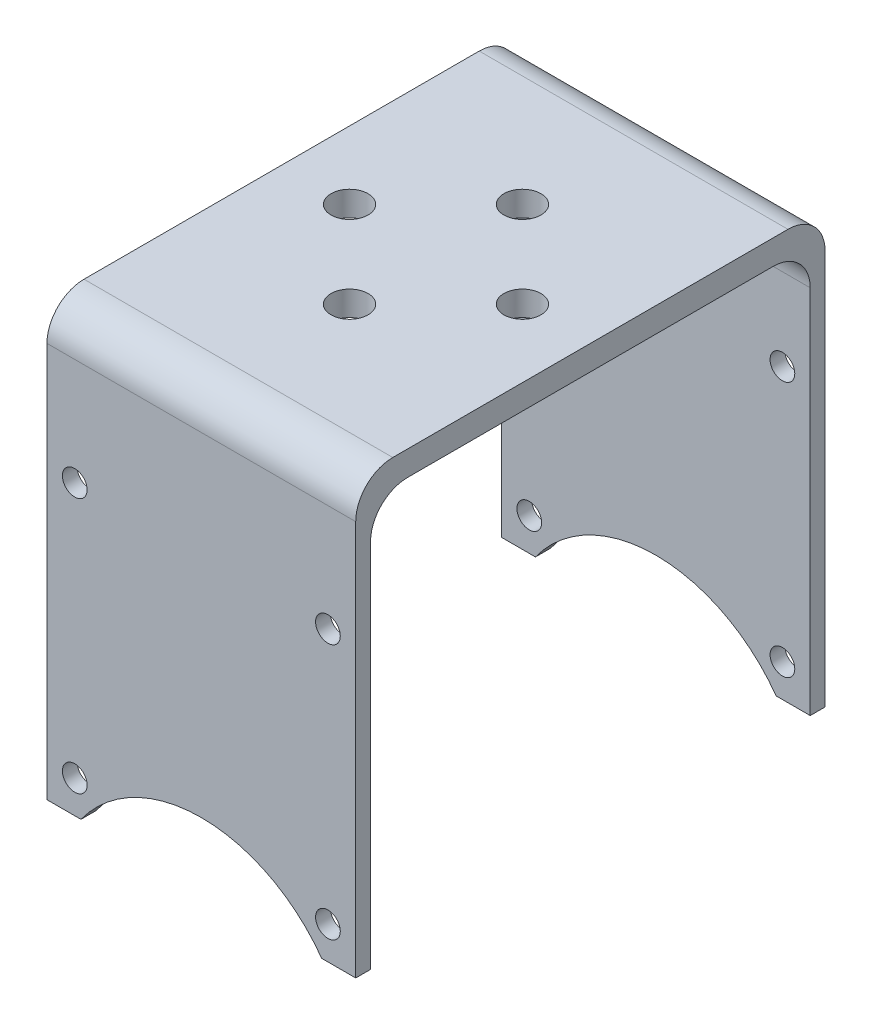
ISO-10303-21;
HEADER;
FILE_DESCRIPTION(('STEP AP214'),'2;1');
FILE_NAME('part.step','',(''),(''),'','','');
FILE_SCHEMA(('AUTOMOTIVE_DESIGN { 1 0 10303 214 1 1 1 1 }'));
ENDSEC;
DATA;
#1=APPLICATION_CONTEXT('core data for automotive mechanical design processes');
#2=APPLICATION_PROTOCOL_DEFINITION('international standard','automotive_design',2000,#1);
#3=PRODUCT_CONTEXT('',#1,'mechanical');
#4=PRODUCT('Part','Part','',(#3));
#5=PRODUCT_RELATED_PRODUCT_CATEGORY('part','',(#4));
#6=PRODUCT_DEFINITION_FORMATION('','',#4);
#7=PRODUCT_DEFINITION_CONTEXT('part definition',#1,'design');
#8=PRODUCT_DEFINITION('design','',#6,#7);
#9=PRODUCT_DEFINITION_SHAPE('','',#8);
#10=(LENGTH_UNIT() NAMED_UNIT(*) SI_UNIT(.MILLI.,.METRE.));
#11=(NAMED_UNIT(*) PLANE_ANGLE_UNIT() SI_UNIT($,.RADIAN.));
#12=(NAMED_UNIT(*) SI_UNIT($,.STERADIAN.) SOLID_ANGLE_UNIT());
#13=UNCERTAINTY_MEASURE_WITH_UNIT(LENGTH_MEASURE(1.E-05),#10,'distance_accuracy_value','');
#14=(GEOMETRIC_REPRESENTATION_CONTEXT(3) GLOBAL_UNCERTAINTY_ASSIGNED_CONTEXT((#13)) GLOBAL_UNIT_ASSIGNED_CONTEXT((#10,
#11,#12)) REPRESENTATION_CONTEXT('',''));
#15=CARTESIAN_POINT('',(0.,0.,0.));
#16=DIRECTION('',(0.,0.,1.));
#17=DIRECTION('',(1.,0.,0.));
#18=AXIS2_PLACEMENT_3D('',#15,#16,#17);
#19=CARTESIAN_POINT('',(0.,0.,0.));
#20=DIRECTION('',(0.,-1.,0.));
#21=DIRECTION('',(0.,0.,-1.));
#22=AXIS2_PLACEMENT_3D('',#19,#20,#21);
#23=PLANE('',#22);
#24=CARTESIAN_POINT('',(0.,0.,-7.));
#25=DIRECTION('',(0.,-1.,0.));
#26=DIRECTION('',(0.,0.,-1.));
#27=AXIS2_PLACEMENT_3D('',#24,#25,#26);
#28=CIRCLE('',#27,1.5);
#29=CARTESIAN_POINT('',(0.,0.,-8.5));
#30=VERTEX_POINT('',#29);
#31=EDGE_CURVE('E375',#30,#30,#28,.T.);
#32=ORIENTED_EDGE('',*,*,#31,.F.);
#33=EDGE_LOOP('',(#32));
#34=FACE_BOUND('',#33,.T.);
#35=CARTESIAN_POINT('',(7.,0.,0.));
#36=DIRECTION('',(0.,-1.,0.));
#37=DIRECTION('',(0.,0.,-1.));
#38=AXIS2_PLACEMENT_3D('',#35,#36,#37);
#39=CIRCLE('',#38,1.5);
#40=CARTESIAN_POINT('',(7.,0.,-1.49999999999998));
#41=VERTEX_POINT('',#40);
#42=EDGE_CURVE('E397',#41,#41,#39,.T.);
#43=ORIENTED_EDGE('',*,*,#42,.F.);
#44=EDGE_LOOP('',(#43));
#45=FACE_BOUND('',#44,.T.);
#46=CARTESIAN_POINT('',(0.,0.,7.));
#47=DIRECTION('',(0.,-1.,0.));
#48=DIRECTION('',(0.,0.,-1.));
#49=AXIS2_PLACEMENT_3D('',#46,#47,#48);
#50=CIRCLE('',#49,1.5);
#51=CARTESIAN_POINT('',(0.,0.,5.5));
#52=VERTEX_POINT('',#51);
#53=EDGE_CURVE('E401',#52,#52,#50,.T.);
#54=ORIENTED_EDGE('',*,*,#53,.F.);
#55=EDGE_LOOP('',(#54));
#56=FACE_BOUND('',#55,.T.);
#57=CARTESIAN_POINT('',(-7.,0.,0.));
#58=DIRECTION('',(0.,-1.,0.));
#59=DIRECTION('',(0.,0.,-1.));
#60=AXIS2_PLACEMENT_3D('',#57,#58,#59);
#61=CIRCLE('',#60,1.5);
#62=CARTESIAN_POINT('',(-7.,0.,-1.50000000000007));
#63=VERTEX_POINT('',#62);
#64=EDGE_CURVE('E405',#63,#63,#61,.T.);
#65=ORIENTED_EDGE('',*,*,#64,.F.);
#66=EDGE_LOOP('',(#65));
#67=FACE_BOUND('',#66,.T.);
#68=DIRECTION('',(0.,0.,-1.));
#69=VECTOR('',#68,1.);
#70=CARTESIAN_POINT('',(12.5,0.,-19.));
#71=LINE('',#70,#69);
#72=CARTESIAN_POINT('',(12.5,0.,14.8));
#73=VERTEX_POINT('',#72);
#74=CARTESIAN_POINT('',(12.5,0.,-14.8));
#75=VERTEX_POINT('',#74);
#76=EDGE_CURVE('E252',#73,#75,#71,.T.);
#77=ORIENTED_EDGE('',*,*,#76,.F.);
#78=DIRECTION('',(1.,0.,0.));
#79=VECTOR('',#78,1.);
#80=CARTESIAN_POINT('',(0.,0.,14.8));
#81=LINE('',#80,#79);
#82=CARTESIAN_POINT('',(-12.5,0.,14.8));
#83=VERTEX_POINT('',#82);
#84=EDGE_CURVE('E279',#73,#83,#81,.F.);
#85=ORIENTED_EDGE('',*,*,#84,.T.);
#86=DIRECTION('',(0.,0.,1.));
#87=VECTOR('',#86,1.);
#88=CARTESIAN_POINT('',(-12.5,0.,10.));
#89=LINE('',#88,#87);
#90=CARTESIAN_POINT('',(-12.5,0.,-14.8));
#91=VERTEX_POINT('',#90);
#92=EDGE_CURVE('E258',#91,#83,#89,.T.);
#93=ORIENTED_EDGE('',*,*,#92,.F.);
#94=DIRECTION('',(-1.,0.,0.));
#95=VECTOR('',#94,1.);
#96=CARTESIAN_POINT('',(0.,0.,-14.8));
#97=LINE('',#96,#95);
#98=EDGE_CURVE('E282',#91,#75,#97,.F.);
#99=ORIENTED_EDGE('',*,*,#98,.T.);
#100=EDGE_LOOP('',(#77,#85,#93,#99));
#101=FACE_BOUND('',#100,.T.);
#102=ADVANCED_FACE('F39',(#34,#45,#56,#67,#101),#23,.T.);
#103=CARTESIAN_POINT('',(0.,2.,0.));
#104=DIRECTION('',(0.,-1.,0.));
#105=DIRECTION('',(0.,0.,-1.));
#106=AXIS2_PLACEMENT_3D('',#103,#104,#105);
#107=PLANE('',#106);
#108=CARTESIAN_POINT('',(0.,2.,-7.));
#109=DIRECTION('',(0.,1.,0.));
#110=DIRECTION('',(0.,0.,1.));
#111=AXIS2_PLACEMENT_3D('',#108,#109,#110);
#112=CIRCLE('',#111,1.5);
#113=CARTESIAN_POINT('',(0.,2.,-5.5));
#114=VERTEX_POINT('',#113);
#115=EDGE_CURVE('E409',#114,#114,#112,.T.);
#116=ORIENTED_EDGE('',*,*,#115,.F.);
#117=EDGE_LOOP('',(#116));
#118=FACE_BOUND('',#117,.T.);
#119=CARTESIAN_POINT('',(7.,2.,0.));
#120=DIRECTION('',(0.,1.,0.));
#121=DIRECTION('',(0.,0.,1.));
#122=AXIS2_PLACEMENT_3D('',#119,#120,#121);
#123=CIRCLE('',#122,1.5);
#124=CARTESIAN_POINT('',(7.,2.,1.50000000000002));
#125=VERTEX_POINT('',#124);
#126=EDGE_CURVE('E418',#125,#125,#123,.T.);
#127=ORIENTED_EDGE('',*,*,#126,.F.);
#128=EDGE_LOOP('',(#127));
#129=FACE_BOUND('',#128,.T.);
#130=CARTESIAN_POINT('',(0.,2.,7.));
#131=DIRECTION('',(0.,1.,0.));
#132=DIRECTION('',(0.,0.,1.));
#133=AXIS2_PLACEMENT_3D('',#130,#131,#132);
#134=CIRCLE('',#133,1.5);
#135=CARTESIAN_POINT('',(0.,2.,8.5));
#136=VERTEX_POINT('',#135);
#137=EDGE_CURVE('E414',#136,#136,#134,.T.);
#138=ORIENTED_EDGE('',*,*,#137,.F.);
#139=EDGE_LOOP('',(#138));
#140=FACE_BOUND('',#139,.T.);
#141=CARTESIAN_POINT('',(-7.,2.,0.));
#142=DIRECTION('',(0.,1.,0.));
#143=DIRECTION('',(0.,0.,1.));
#144=AXIS2_PLACEMENT_3D('',#141,#142,#143);
#145=CIRCLE('',#144,1.5);
#146=CARTESIAN_POINT('',(-7.,2.,1.49999999999993));
#147=VERTEX_POINT('',#146);
#148=EDGE_CURVE('E410',#147,#147,#145,.T.);
#149=ORIENTED_EDGE('',*,*,#148,.F.);
#150=EDGE_LOOP('',(#149));
#151=FACE_BOUND('',#150,.T.);
#152=DIRECTION('',(1.,0.,0.));
#153=VECTOR('',#152,1.);
#154=CARTESIAN_POINT('',(0.,2.,16.));
#155=LINE('',#154,#153);
#156=CARTESIAN_POINT('',(-12.5,2.,16.));
#157=VERTEX_POINT('',#156);
#158=CARTESIAN_POINT('',(12.5,2.,16.));
#159=VERTEX_POINT('',#158);
#160=EDGE_CURVE('E285',#157,#159,#155,.T.);
#161=ORIENTED_EDGE('',*,*,#160,.T.);
#162=DIRECTION('',(0.,0.,-1.));
#163=VECTOR('',#162,1.);
#164=CARTESIAN_POINT('',(12.5,2.,-19.));
#165=LINE('',#164,#163);
#166=CARTESIAN_POINT('',(12.5,2.,-16.));
#167=VERTEX_POINT('',#166);
#168=EDGE_CURVE('E253',#159,#167,#165,.T.);
#169=ORIENTED_EDGE('',*,*,#168,.T.);
#170=DIRECTION('',(-1.,0.,0.));
#171=VECTOR('',#170,1.);
#172=CARTESIAN_POINT('',(0.,2.,-16.));
#173=LINE('',#172,#171);
#174=CARTESIAN_POINT('',(-12.5,2.,-16.));
#175=VERTEX_POINT('',#174);
#176=EDGE_CURVE('E289',#167,#175,#173,.T.);
#177=ORIENTED_EDGE('',*,*,#176,.T.);
#178=DIRECTION('',(0.,0.,1.));
#179=VECTOR('',#178,1.);
#180=CARTESIAN_POINT('',(-12.5,2.,10.));
#181=LINE('',#180,#179);
#182=EDGE_CURVE('E257',#175,#157,#181,.T.);
#183=ORIENTED_EDGE('',*,*,#182,.T.);
#184=EDGE_LOOP('',(#161,#169,#177,#183));
#185=FACE_BOUND('',#184,.T.);
#186=ADVANCED_FACE('F428',(#118,#129,#140,#151,#185),#107,.F.);
#187=CARTESIAN_POINT('',(-12.5,2.,-19.));
#188=DIRECTION('',(0.,0.,1.));
#189=DIRECTION('',(1.,0.,0.));
#190=AXIS2_PLACEMENT_3D('',#187,#188,#189);
#191=PLANE('',#190);
#192=DIRECTION('',(0.,-1.,0.));
#193=VECTOR('',#192,1.);
#194=CARTESIAN_POINT('',(12.5,2.,-19.));
#195=LINE('',#194,#193);
#196=CARTESIAN_POINT('',(12.5,-1.,-19.));
#197=VERTEX_POINT('',#196);
#198=CARTESIAN_POINT('',(12.5,-33.,-19.));
#199=VERTEX_POINT('',#198);
#200=EDGE_CURVE('E155',#197,#199,#195,.T.);
#201=ORIENTED_EDGE('',*,*,#200,.T.);
#202=DIRECTION('',(-1.,0.,0.));
#203=VECTOR('',#202,1.);
#204=CARTESIAN_POINT('',(9.74679434480896,-33.,-19.));
#205=LINE('',#204,#203);
#206=CARTESIAN_POINT('',(9.74679434480896,-33.,-19.));
#207=VERTEX_POINT('',#206);
#208=EDGE_CURVE('E159',#199,#207,#205,.T.);
#209=ORIENTED_EDGE('',*,*,#208,.T.);
#210=CARTESIAN_POINT('',(0.,-40.,-19.));
#211=DIRECTION('',(0.,0.,1.));
#212=DIRECTION('',(-1.,0.,0.));
#213=AXIS2_PLACEMENT_3D('',#210,#211,#212);
#214=CIRCLE('',#213,12.);
#215=CARTESIAN_POINT('',(-9.74679434480896,-33.,-19.));
#216=VERTEX_POINT('',#215);
#217=EDGE_CURVE('E174',#207,#216,#214,.T.);
#218=ORIENTED_EDGE('',*,*,#217,.T.);
#219=DIRECTION('',(-1.,0.,0.));
#220=VECTOR('',#219,1.);
#221=CARTESIAN_POINT('',(-12.5,-33.,-19.));
#222=LINE('',#221,#220);
#223=CARTESIAN_POINT('',(-12.5,-33.,-19.));
#224=VERTEX_POINT('',#223);
#225=EDGE_CURVE('E188',#216,#224,#222,.T.);
#226=ORIENTED_EDGE('',*,*,#225,.T.);
#227=DIRECTION('',(0.,-1.,0.));
#228=VECTOR('',#227,1.);
#229=CARTESIAN_POINT('',(-12.5,2.,-19.));
#230=LINE('',#229,#228);
#231=CARTESIAN_POINT('',(-12.5,-1.,-19.));
#232=VERTEX_POINT('',#231);
#233=EDGE_CURVE('E167',#232,#224,#230,.T.);
#234=ORIENTED_EDGE('',*,*,#233,.F.);
#235=DIRECTION('',(-1.,0.,0.));
#236=VECTOR('',#235,1.);
#237=CARTESIAN_POINT('',(-12.5,-1.,-19.));
#238=LINE('',#237,#236);
#239=EDGE_CURVE('E162',#232,#197,#238,.F.);
#240=ORIENTED_EDGE('',*,*,#239,.T.);
#241=EDGE_LOOP('',(#201,#209,#218,#226,#234,#240));
#242=FACE_BOUND('',#241,.T.);
#243=CARTESIAN_POINT('',(-10.25,-30.35,-19.));
#244=DIRECTION('',(0.,0.,1.));
#245=DIRECTION('',(1.,0.,0.));
#246=AXIS2_PLACEMENT_3D('',#243,#244,#245);
#247=CIRCLE('',#246,1.);
#248=CARTESIAN_POINT('',(-9.25,-30.35,-19.));
#249=VERTEX_POINT('',#248);
#250=EDGE_CURVE('E201',#249,#249,#247,.T.);
#251=ORIENTED_EDGE('',*,*,#250,.T.);
#252=EDGE_LOOP('',(#251));
#253=FACE_BOUND('',#252,.T.);
#254=CARTESIAN_POINT('',(-10.25,-9.65,-19.));
#255=DIRECTION('',(0.,0.,1.));
#256=DIRECTION('',(1.,0.,0.));
#257=AXIS2_PLACEMENT_3D('',#254,#255,#256);
#258=CIRCLE('',#257,1.);
#259=CARTESIAN_POINT('',(-9.25,-9.65,-19.));
#260=VERTEX_POINT('',#259);
#261=EDGE_CURVE('E210',#260,#260,#258,.T.);
#262=ORIENTED_EDGE('',*,*,#261,.T.);
#263=EDGE_LOOP('',(#262));
#264=FACE_BOUND('',#263,.T.);
#265=CARTESIAN_POINT('',(10.25,-9.65,-19.));
#266=DIRECTION('',(0.,0.,1.));
#267=DIRECTION('',(1.,0.,0.));
#268=AXIS2_PLACEMENT_3D('',#265,#266,#267);
#269=CIRCLE('',#268,1.);
#270=CARTESIAN_POINT('',(11.25,-9.65,-19.));
#271=VERTEX_POINT('',#270);
#272=EDGE_CURVE('E383',#271,#271,#269,.T.);
#273=ORIENTED_EDGE('',*,*,#272,.T.);
#274=EDGE_LOOP('',(#273));
#275=FACE_BOUND('',#274,.T.);
#276=CARTESIAN_POINT('',(10.25,-30.35,-19.));
#277=DIRECTION('',(0.,0.,1.));
#278=DIRECTION('',(1.,0.,0.));
#279=AXIS2_PLACEMENT_3D('',#276,#277,#278);
#280=CIRCLE('',#279,1.);
#281=CARTESIAN_POINT('',(11.25,-30.35,-19.));
#282=VERTEX_POINT('',#281);
#283=EDGE_CURVE('E191',#282,#282,#280,.T.);
#284=ORIENTED_EDGE('',*,*,#283,.T.);
#285=EDGE_LOOP('',(#284));
#286=FACE_BOUND('',#285,.T.);
#287=ADVANCED_FACE('F156',(#242,#253,#264,#275,#286),#191,.F.);
#288=CARTESIAN_POINT('',(-12.5,2.,10.));
#289=DIRECTION('',(1.,0.,0.));
#290=DIRECTION('',(0.,0.,-1.));
#291=AXIS2_PLACEMENT_3D('',#288,#289,#290);
#292=PLANE('',#291);
#293=CARTESIAN_POINT('',(-12.5,-3.,14.8));
#294=DIRECTION('',(1.,0.,0.));
#295=DIRECTION('',(0.,0.,-1.));
#296=AXIS2_PLACEMENT_3D('',#293,#294,#295);
#297=CIRCLE('',#296,3.);
#298=CARTESIAN_POINT('',(-12.5,-3.,17.8));
#299=VERTEX_POINT('',#298);
#300=EDGE_CURVE('E325',#83,#299,#297,.T.);
#301=ORIENTED_EDGE('',*,*,#300,.T.);
#302=DIRECTION('',(0.,1.,0.));
#303=VECTOR('',#302,1.);
#304=CARTESIAN_POINT('',(-12.5,-40.,17.8));
#305=LINE('',#304,#303);
#306=CARTESIAN_POINT('',(-12.5,-33.,17.8));
#307=VERTEX_POINT('',#306);
#308=EDGE_CURVE('E249',#307,#299,#305,.T.);
#309=ORIENTED_EDGE('',*,*,#308,.F.);
#310=DIRECTION('',(0.,0.,1.));
#311=VECTOR('',#310,1.);
#312=CARTESIAN_POINT('',(-12.5,-33.,-19.));
#313=LINE('',#312,#311);
#314=CARTESIAN_POINT('',(-12.5,-33.,19.));
#315=VERTEX_POINT('',#314);
#316=EDGE_CURVE('E357',#307,#315,#313,.T.);
#317=ORIENTED_EDGE('',*,*,#316,.T.);
#318=DIRECTION('',(0.,-1.,0.));
#319=VECTOR('',#318,1.);
#320=CARTESIAN_POINT('',(-12.5,2.,19.));
#321=LINE('',#320,#319);
#322=CARTESIAN_POINT('',(-12.5,-1.,19.));
#323=VERTEX_POINT('',#322);
#324=EDGE_CURVE('E271',#323,#315,#321,.T.);
#325=ORIENTED_EDGE('',*,*,#324,.F.);
#326=CARTESIAN_POINT('',(-12.5,-1.,16.));
#327=DIRECTION('',(1.,0.,0.));
#328=DIRECTION('',(0.,0.,-1.));
#329=AXIS2_PLACEMENT_3D('',#326,#327,#328);
#330=CIRCLE('',#329,3.);
#331=EDGE_CURVE('E307',#323,#157,#330,.F.);
#332=ORIENTED_EDGE('',*,*,#331,.T.);
#333=ORIENTED_EDGE('',*,*,#182,.F.);
#334=CARTESIAN_POINT('',(-12.5,-1.,-16.));
#335=DIRECTION('',(1.,0.,0.));
#336=DIRECTION('',(0.,0.,-1.));
#337=AXIS2_PLACEMENT_3D('',#334,#335,#336);
#338=CIRCLE('',#337,3.);
#339=EDGE_CURVE('E293',#175,#232,#338,.F.);
#340=ORIENTED_EDGE('',*,*,#339,.T.);
#341=ORIENTED_EDGE('',*,*,#233,.T.);
#342=CARTESIAN_POINT('',(-12.5,-33.,-17.8));
#343=VERTEX_POINT('',#342);
#344=EDGE_CURVE('E200',#224,#343,#313,.T.);
#345=ORIENTED_EDGE('',*,*,#344,.T.);
#346=DIRECTION('',(0.,1.,0.));
#347=VECTOR('',#346,1.);
#348=CARTESIAN_POINT('',(-12.5,-40.,-17.8));
#349=LINE('',#348,#347);
#350=CARTESIAN_POINT('',(-12.5,-3.,-17.8));
#351=VERTEX_POINT('',#350);
#352=EDGE_CURVE('E241',#343,#351,#349,.T.);
#353=ORIENTED_EDGE('',*,*,#352,.T.);
#354=CARTESIAN_POINT('',(-12.5,-3.,-14.8));
#355=DIRECTION('',(1.,0.,0.));
#356=DIRECTION('',(0.,0.,-1.));
#357=AXIS2_PLACEMENT_3D('',#354,#355,#356);
#358=CIRCLE('',#357,3.);
#359=EDGE_CURVE('E314',#351,#91,#358,.T.);
#360=ORIENTED_EDGE('',*,*,#359,.T.);
#361=ORIENTED_EDGE('',*,*,#92,.T.);
#362=EDGE_LOOP('',(#301,#309,#317,#325,#332,#333,#340,#341,#345,#353,#360,#361));
#363=FACE_BOUND('',#362,.T.);
#364=ADVANCED_FACE('F472',(#363),#292,.F.);
#365=CARTESIAN_POINT('',(-12.5,2.,19.));
#366=DIRECTION('',(0.,0.,-1.));
#367=DIRECTION('',(-1.,0.,0.));
#368=AXIS2_PLACEMENT_3D('',#365,#366,#367);
#369=PLANE('',#368);
#370=ORIENTED_EDGE('',*,*,#324,.T.);
#371=DIRECTION('',(-1.,0.,0.));
#372=VECTOR('',#371,1.);
#373=CARTESIAN_POINT('',(-12.5,-33.,19.));
#374=LINE('',#373,#372);
#375=CARTESIAN_POINT('',(-9.74679434480896,-33.,19.));
#376=VERTEX_POINT('',#375);
#377=EDGE_CURVE('E175',#376,#315,#374,.T.);
#378=ORIENTED_EDGE('',*,*,#377,.F.);
#379=CARTESIAN_POINT('',(0.,-40.,19.));
#380=DIRECTION('',(0.,0.,1.));
#381=DIRECTION('',(-1.,0.,0.));
#382=AXIS2_PLACEMENT_3D('',#379,#380,#381);
#383=CIRCLE('',#382,12.);
#384=CARTESIAN_POINT('',(9.74679434480896,-33.,19.));
#385=VERTEX_POINT('',#384);
#386=EDGE_CURVE('E368',#385,#376,#383,.T.);
#387=ORIENTED_EDGE('',*,*,#386,.F.);
#388=DIRECTION('',(-1.,0.,0.));
#389=VECTOR('',#388,1.);
#390=CARTESIAN_POINT('',(9.74679434480896,-33.,19.));
#391=LINE('',#390,#389);
#392=CARTESIAN_POINT('',(12.5,-33.,19.));
#393=VERTEX_POINT('',#392);
#394=EDGE_CURVE('E372',#393,#385,#391,.T.);
#395=ORIENTED_EDGE('',*,*,#394,.F.);
#396=DIRECTION('',(0.,-1.,0.));
#397=VECTOR('',#396,1.);
#398=CARTESIAN_POINT('',(12.5,2.,19.));
#399=LINE('',#398,#397);
#400=CARTESIAN_POINT('',(12.5,-1.,19.));
#401=VERTEX_POINT('',#400);
#402=EDGE_CURVE('E262',#401,#393,#399,.T.);
#403=ORIENTED_EDGE('',*,*,#402,.F.);
#404=DIRECTION('',(1.,0.,0.));
#405=VECTOR('',#404,1.);
#406=CARTESIAN_POINT('',(-12.5,-1.,19.));
#407=LINE('',#406,#405);
#408=EDGE_CURVE('E304',#401,#323,#407,.F.);
#409=ORIENTED_EDGE('',*,*,#408,.T.);
#410=EDGE_LOOP('',(#370,#378,#387,#395,#403,#409));
#411=FACE_BOUND('',#410,.T.);
#412=CARTESIAN_POINT('',(-10.25,-30.35,19.));
#413=DIRECTION('',(0.,0.,1.));
#414=DIRECTION('',(1.,0.,0.));
#415=AXIS2_PLACEMENT_3D('',#412,#413,#414);
#416=CIRCLE('',#415,1.);
#417=CARTESIAN_POINT('',(-9.25,-30.35,19.));
#418=VERTEX_POINT('',#417);
#419=EDGE_CURVE('E206',#418,#418,#416,.T.);
#420=ORIENTED_EDGE('',*,*,#419,.F.);
#421=EDGE_LOOP('',(#420));
#422=FACE_BOUND('',#421,.T.);
#423=CARTESIAN_POINT('',(-10.25,-9.65,19.));
#424=DIRECTION('',(0.,0.,1.));
#425=DIRECTION('',(1.,0.,0.));
#426=AXIS2_PLACEMENT_3D('',#423,#424,#425);
#427=CIRCLE('',#426,1.);
#428=CARTESIAN_POINT('',(-9.25,-9.65,19.));
#429=VERTEX_POINT('',#428);
#430=EDGE_CURVE('E387',#429,#429,#427,.T.);
#431=ORIENTED_EDGE('',*,*,#430,.F.);
#432=EDGE_LOOP('',(#431));
#433=FACE_BOUND('',#432,.T.);
#434=CARTESIAN_POINT('',(10.25,-9.65,19.));
#435=DIRECTION('',(0.,0.,1.));
#436=DIRECTION('',(1.,0.,0.));
#437=AXIS2_PLACEMENT_3D('',#434,#435,#436);
#438=CIRCLE('',#437,1.);
#439=CARTESIAN_POINT('',(11.25,-9.65,19.));
#440=VERTEX_POINT('',#439);
#441=EDGE_CURVE('E195',#440,#440,#438,.T.);
#442=ORIENTED_EDGE('',*,*,#441,.F.);
#443=EDGE_LOOP('',(#442));
#444=FACE_BOUND('',#443,.T.);
#445=CARTESIAN_POINT('',(10.25,-30.35,19.));
#446=DIRECTION('',(0.,0.,1.));
#447=DIRECTION('',(1.,0.,0.));
#448=AXIS2_PLACEMENT_3D('',#445,#446,#447);
#449=CIRCLE('',#448,1.);
#450=CARTESIAN_POINT('',(11.25,-30.35,19.));
#451=VERTEX_POINT('',#450);
#452=EDGE_CURVE('E196',#451,#451,#449,.T.);
#453=ORIENTED_EDGE('',*,*,#452,.F.);
#454=EDGE_LOOP('',(#453));
#455=FACE_BOUND('',#454,.T.);
#456=ADVANCED_FACE('F449',(#411,#422,#433,#444,#455),#369,.F.);
#457=CARTESIAN_POINT('',(12.5,2.,10.));
#458=DIRECTION('',(-1.,0.,0.));
#459=DIRECTION('',(0.,0.,1.));
#460=AXIS2_PLACEMENT_3D('',#457,#458,#459);
#461=PLANE('',#460);
#462=ORIENTED_EDGE('',*,*,#402,.T.);
#463=DIRECTION('',(0.,0.,1.));
#464=VECTOR('',#463,1.);
#465=CARTESIAN_POINT('',(12.5,-33.,-19.));
#466=LINE('',#465,#464);
#467=CARTESIAN_POINT('',(12.5,-33.,17.8));
#468=VERTEX_POINT('',#467);
#469=EDGE_CURVE('E182',#468,#393,#466,.T.);
#470=ORIENTED_EDGE('',*,*,#469,.F.);
#471=DIRECTION('',(0.,1.,0.));
#472=VECTOR('',#471,1.);
#473=CARTESIAN_POINT('',(12.5,-40.,17.8));
#474=LINE('',#473,#472);
#475=CARTESIAN_POINT('',(12.5,-3.,17.8));
#476=VERTEX_POINT('',#475);
#477=EDGE_CURVE('E246',#468,#476,#474,.T.);
#478=ORIENTED_EDGE('',*,*,#477,.T.);
#479=CARTESIAN_POINT('',(12.5,-3.,14.8));
#480=DIRECTION('',(-1.,0.,0.));
#481=DIRECTION('',(0.,0.,1.));
#482=AXIS2_PLACEMENT_3D('',#479,#480,#481);
#483=CIRCLE('',#482,3.);
#484=EDGE_CURVE('E321',#476,#73,#483,.T.);
#485=ORIENTED_EDGE('',*,*,#484,.T.);
#486=ORIENTED_EDGE('',*,*,#76,.T.);
#487=CARTESIAN_POINT('',(12.5,-3.,-14.8));
#488=DIRECTION('',(-1.,0.,0.));
#489=DIRECTION('',(0.,0.,1.));
#490=AXIS2_PLACEMENT_3D('',#487,#488,#489);
#491=CIRCLE('',#490,3.);
#492=CARTESIAN_POINT('',(12.5,-3.,-17.8));
#493=VERTEX_POINT('',#492);
#494=EDGE_CURVE('E318',#75,#493,#491,.T.);
#495=ORIENTED_EDGE('',*,*,#494,.T.);
#496=DIRECTION('',(0.,1.,0.));
#497=VECTOR('',#496,1.);
#498=CARTESIAN_POINT('',(12.5,-40.,-17.8));
#499=LINE('',#498,#497);
#500=CARTESIAN_POINT('',(12.5,-33.,-17.8));
#501=VERTEX_POINT('',#500);
#502=EDGE_CURVE('E180',#501,#493,#499,.T.);
#503=ORIENTED_EDGE('',*,*,#502,.F.);
#504=EDGE_CURVE('E64',#199,#501,#466,.T.);
#505=ORIENTED_EDGE('',*,*,#504,.F.);
#506=ORIENTED_EDGE('',*,*,#200,.F.);
#507=CARTESIAN_POINT('',(12.5,-1.,-16.));
#508=DIRECTION('',(-1.,0.,0.));
#509=DIRECTION('',(0.,0.,1.));
#510=AXIS2_PLACEMENT_3D('',#507,#508,#509);
#511=CIRCLE('',#510,3.);
#512=EDGE_CURVE('E298',#197,#167,#511,.F.);
#513=ORIENTED_EDGE('',*,*,#512,.T.);
#514=ORIENTED_EDGE('',*,*,#168,.F.);
#515=CARTESIAN_POINT('',(12.5,-1.,16.));
#516=DIRECTION('',(-1.,0.,0.));
#517=DIRECTION('',(0.,0.,1.));
#518=AXIS2_PLACEMENT_3D('',#515,#516,#517);
#519=CIRCLE('',#518,3.);
#520=EDGE_CURVE('E301',#159,#401,#519,.F.);
#521=ORIENTED_EDGE('',*,*,#520,.T.);
#522=EDGE_LOOP('',(#462,#470,#478,#485,#486,#495,#503,#505,#506,#513,#514,#521));
#523=FACE_BOUND('',#522,.T.);
#524=ADVANCED_FACE('F178',(#523),#461,.F.);
#525=CARTESIAN_POINT('',(-12.5,-40.,17.8));
#526=DIRECTION('',(0.,0.,1.));
#527=DIRECTION('',(1.,0.,0.));
#528=AXIS2_PLACEMENT_3D('',#525,#526,#527);
#529=PLANE('',#528);
#530=CARTESIAN_POINT('',(10.25,-30.35,17.8));
#531=DIRECTION('',(0.,0.,1.));
#532=DIRECTION('',(1.,0.,0.));
#533=AXIS2_PLACEMENT_3D('',#530,#531,#532);
#534=CIRCLE('',#533,1.);
#535=CARTESIAN_POINT('',(11.25,-30.35,17.8));
#536=VERTEX_POINT('',#535);
#537=EDGE_CURVE('E237',#536,#536,#534,.T.);
#538=ORIENTED_EDGE('',*,*,#537,.T.);
#539=EDGE_LOOP('',(#538));
#540=FACE_BOUND('',#539,.T.);
#541=CARTESIAN_POINT('',(10.25,-9.65,17.8));
#542=DIRECTION('',(0.,0.,1.));
#543=DIRECTION('',(1.,0.,0.));
#544=AXIS2_PLACEMENT_3D('',#541,#542,#543);
#545=CIRCLE('',#544,1.);
#546=CARTESIAN_POINT('',(11.25,-9.65,17.8));
#547=VERTEX_POINT('',#546);
#548=EDGE_CURVE('E221',#547,#547,#545,.T.);
#549=ORIENTED_EDGE('',*,*,#548,.T.);
#550=EDGE_LOOP('',(#549));
#551=FACE_BOUND('',#550,.T.);
#552=CARTESIAN_POINT('',(-10.25,-9.65,17.8));
#553=DIRECTION('',(0.,0.,1.));
#554=DIRECTION('',(1.,0.,0.));
#555=AXIS2_PLACEMENT_3D('',#552,#553,#554);
#556=CIRCLE('',#555,1.);
#557=CARTESIAN_POINT('',(-9.25,-9.65,17.8));
#558=VERTEX_POINT('',#557);
#559=EDGE_CURVE('E216',#558,#558,#556,.T.);
#560=ORIENTED_EDGE('',*,*,#559,.T.);
#561=EDGE_LOOP('',(#560));
#562=FACE_BOUND('',#561,.T.);
#563=CARTESIAN_POINT('',(-10.25,-30.35,17.8));
#564=DIRECTION('',(0.,0.,1.));
#565=DIRECTION('',(1.,0.,0.));
#566=AXIS2_PLACEMENT_3D('',#563,#564,#565);
#567=CIRCLE('',#566,1.);
#568=CARTESIAN_POINT('',(-9.25,-30.35,17.8));
#569=VERTEX_POINT('',#568);
#570=EDGE_CURVE('E211',#569,#569,#567,.T.);
#571=ORIENTED_EDGE('',*,*,#570,.T.);
#572=EDGE_LOOP('',(#571));
#573=FACE_BOUND('',#572,.T.);
#574=CARTESIAN_POINT('',(0.,-40.,17.8));
#575=DIRECTION('',(0.,0.,1.));
#576=DIRECTION('',(1.,0.,0.));
#577=AXIS2_PLACEMENT_3D('',#574,#575,#576);
#578=CIRCLE('',#577,12.);
#579=CARTESIAN_POINT('',(9.74679434480897,-33.,17.8));
#580=VERTEX_POINT('',#579);
#581=CARTESIAN_POINT('',(-9.74679434480896,-33.,17.8));
#582=VERTEX_POINT('',#581);
#583=EDGE_CURVE('E229',#580,#582,#578,.T.);
#584=ORIENTED_EDGE('',*,*,#583,.T.);
#585=DIRECTION('',(-1.,0.,0.));
#586=VECTOR('',#585,1.);
#587=CARTESIAN_POINT('',(-12.5,-33.,17.8));
#588=LINE('',#587,#586);
#589=EDGE_CURVE('E233',#582,#307,#588,.T.);
#590=ORIENTED_EDGE('',*,*,#589,.T.);
#591=ORIENTED_EDGE('',*,*,#308,.T.);
#592=DIRECTION('',(1.,0.,0.));
#593=VECTOR('',#592,1.);
#594=CARTESIAN_POINT('',(-12.5,-3.,17.8));
#595=LINE('',#594,#593);
#596=EDGE_CURVE('E310',#299,#476,#595,.T.);
#597=ORIENTED_EDGE('',*,*,#596,.T.);
#598=ORIENTED_EDGE('',*,*,#477,.F.);
#599=DIRECTION('',(-1.,0.,0.));
#600=VECTOR('',#599,1.);
#601=CARTESIAN_POINT('',(-12.5,-33.,17.8));
#602=LINE('',#601,#600);
#603=EDGE_CURVE('E225',#468,#580,#602,.T.);
#604=ORIENTED_EDGE('',*,*,#603,.T.);
#605=EDGE_LOOP('',(#584,#590,#591,#597,#598,#604));
#606=FACE_BOUND('',#605,.T.);
#607=ADVANCED_FACE('F458',(#540,#551,#562,#573,#606),#529,.F.);
#608=CARTESIAN_POINT('',(12.5,-40.,-17.8));
#609=DIRECTION('',(0.,0.,-1.));
#610=DIRECTION('',(-1.,0.,0.));
#611=AXIS2_PLACEMENT_3D('',#608,#609,#610);
#612=PLANE('',#611);
#613=CARTESIAN_POINT('',(10.25,-30.35,-17.8));
#614=DIRECTION('',(0.,0.,-1.));
#615=DIRECTION('',(-1.,0.,0.));
#616=AXIS2_PLACEMENT_3D('',#613,#614,#615);
#617=CIRCLE('',#616,1.);
#618=CARTESIAN_POINT('',(9.25,-30.35,-17.8));
#619=VERTEX_POINT('',#618);
#620=EDGE_CURVE('E43',#619,#619,#617,.T.);
#621=ORIENTED_EDGE('',*,*,#620,.T.);
#622=EDGE_LOOP('',(#621));
#623=FACE_BOUND('',#622,.T.);
#624=CARTESIAN_POINT('',(10.25,-9.65,-17.8));
#625=DIRECTION('',(0.,0.,-1.));
#626=DIRECTION('',(-1.,0.,0.));
#627=AXIS2_PLACEMENT_3D('',#624,#625,#626);
#628=CIRCLE('',#627,1.);
#629=CARTESIAN_POINT('',(9.25,-9.65,-17.8));
#630=VERTEX_POINT('',#629);
#631=EDGE_CURVE('E220',#630,#630,#628,.T.);
#632=ORIENTED_EDGE('',*,*,#631,.T.);
#633=EDGE_LOOP('',(#632));
#634=FACE_BOUND('',#633,.T.);
#635=CARTESIAN_POINT('',(-10.25,-9.65,-17.8));
#636=DIRECTION('',(0.,0.,-1.));
#637=DIRECTION('',(-1.,0.,0.));
#638=AXIS2_PLACEMENT_3D('',#635,#636,#637);
#639=CIRCLE('',#638,1.);
#640=CARTESIAN_POINT('',(-11.25,-9.65,-17.8));
#641=VERTEX_POINT('',#640);
#642=EDGE_CURVE('E215',#641,#641,#639,.T.);
#643=ORIENTED_EDGE('',*,*,#642,.T.);
#644=EDGE_LOOP('',(#643));
#645=FACE_BOUND('',#644,.T.);
#646=CARTESIAN_POINT('',(-10.25,-30.35,-17.8));
#647=DIRECTION('',(0.,0.,-1.));
#648=DIRECTION('',(-1.,0.,0.));
#649=AXIS2_PLACEMENT_3D('',#646,#647,#648);
#650=CIRCLE('',#649,1.);
#651=CARTESIAN_POINT('',(-11.25,-30.35,-17.8));
#652=VERTEX_POINT('',#651);
#653=EDGE_CURVE('E205',#652,#652,#650,.T.);
#654=ORIENTED_EDGE('',*,*,#653,.T.);
#655=EDGE_LOOP('',(#654));
#656=FACE_BOUND('',#655,.T.);
#657=ORIENTED_EDGE('',*,*,#352,.F.);
#658=DIRECTION('',(1.,0.,0.));
#659=VECTOR('',#658,1.);
#660=CARTESIAN_POINT('',(12.5,-33.,-17.8));
#661=LINE('',#660,#659);
#662=CARTESIAN_POINT('',(-9.74679434480896,-33.,-17.8));
#663=VERTEX_POINT('',#662);
#664=EDGE_CURVE('E12',#343,#663,#661,.T.);
#665=ORIENTED_EDGE('',*,*,#664,.T.);
#666=CARTESIAN_POINT('',(0.,-40.,-17.8));
#667=DIRECTION('',(0.,0.,-1.));
#668=DIRECTION('',(-1.,0.,0.));
#669=AXIS2_PLACEMENT_3D('',#666,#667,#668);
#670=CIRCLE('',#669,12.);
#671=CARTESIAN_POINT('',(9.74679434480896,-33.,-17.8));
#672=VERTEX_POINT('',#671);
#673=EDGE_CURVE('E49',#663,#672,#670,.T.);
#674=ORIENTED_EDGE('',*,*,#673,.T.);
#675=DIRECTION('',(1.,0.,0.));
#676=VECTOR('',#675,1.);
#677=CARTESIAN_POINT('',(12.5,-33.,-17.8));
#678=LINE('',#677,#676);
#679=EDGE_CURVE('E329',#672,#501,#678,.T.);
#680=ORIENTED_EDGE('',*,*,#679,.T.);
#681=ORIENTED_EDGE('',*,*,#502,.T.);
#682=DIRECTION('',(-1.,0.,0.));
#683=VECTOR('',#682,1.);
#684=CARTESIAN_POINT('',(12.5,-3.,-17.8));
#685=LINE('',#684,#683);
#686=EDGE_CURVE('E166',#493,#351,#685,.T.);
#687=ORIENTED_EDGE('',*,*,#686,.T.);
#688=EDGE_LOOP('',(#657,#665,#674,#680,#681,#687));
#689=FACE_BOUND('',#688,.T.);
#690=ADVANCED_FACE('F345',(#623,#634,#645,#656,#689),#612,.F.);
#691=CARTESIAN_POINT('',(12.5,-3.,-14.8));
#692=DIRECTION('',(-1.,0.,0.));
#693=DIRECTION('',(0.,0.,1.));
#694=AXIS2_PLACEMENT_3D('',#691,#692,#693);
#695=CYLINDRICAL_SURFACE('',#694,3.);
#696=ORIENTED_EDGE('',*,*,#494,.F.);
#697=ORIENTED_EDGE('',*,*,#98,.F.);
#698=ORIENTED_EDGE('',*,*,#359,.F.);
#699=ORIENTED_EDGE('',*,*,#686,.F.);
#700=EDGE_LOOP('',(#696,#697,#698,#699));
#701=FACE_BOUND('',#700,.T.);
#702=ADVANCED_FACE('F469',(#701),#695,.F.);
#703=CARTESIAN_POINT('',(0.,-1.,-16.));
#704=DIRECTION('',(-1.,0.,0.));
#705=DIRECTION('',(0.,0.,1.));
#706=AXIS2_PLACEMENT_3D('',#703,#704,#705);
#707=CYLINDRICAL_SURFACE('',#706,3.);
#708=ORIENTED_EDGE('',*,*,#512,.F.);
#709=ORIENTED_EDGE('',*,*,#239,.F.);
#710=ORIENTED_EDGE('',*,*,#339,.F.);
#711=ORIENTED_EDGE('',*,*,#176,.F.);
#712=EDGE_LOOP('',(#708,#709,#710,#711));
#713=FACE_BOUND('',#712,.T.);
#714=ADVANCED_FACE('F475',(#713),#707,.T.);
#715=CARTESIAN_POINT('',(0.,-1.,16.));
#716=DIRECTION('',(1.,0.,0.));
#717=DIRECTION('',(0.,0.,-1.));
#718=AXIS2_PLACEMENT_3D('',#715,#716,#717);
#719=CYLINDRICAL_SURFACE('',#718,3.);
#720=ORIENTED_EDGE('',*,*,#331,.F.);
#721=ORIENTED_EDGE('',*,*,#408,.F.);
#722=ORIENTED_EDGE('',*,*,#520,.F.);
#723=ORIENTED_EDGE('',*,*,#160,.F.);
#724=EDGE_LOOP('',(#720,#721,#722,#723));
#725=FACE_BOUND('',#724,.T.);
#726=ADVANCED_FACE('F443',(#725),#719,.T.);
#727=CARTESIAN_POINT('',(-12.5,-3.,14.8));
#728=DIRECTION('',(1.,0.,0.));
#729=DIRECTION('',(0.,0.,-1.));
#730=AXIS2_PLACEMENT_3D('',#727,#728,#729);
#731=CYLINDRICAL_SURFACE('',#730,3.);
#732=ORIENTED_EDGE('',*,*,#300,.F.);
#733=ORIENTED_EDGE('',*,*,#84,.F.);
#734=ORIENTED_EDGE('',*,*,#484,.F.);
#735=ORIENTED_EDGE('',*,*,#596,.F.);
#736=EDGE_LOOP('',(#732,#733,#734,#735));
#737=FACE_BOUND('',#736,.T.);
#738=ADVANCED_FACE('F41',(#737),#731,.F.);
#739=CARTESIAN_POINT('',(-10.25,-30.35,-19.));
#740=DIRECTION('',(0.,0.,1.));
#741=DIRECTION('',(1.,0.,0.));
#742=AXIS2_PLACEMENT_3D('',#739,#740,#741);
#743=CYLINDRICAL_SURFACE('',#742,1.);
#744=ORIENTED_EDGE('',*,*,#250,.F.);
#745=EDGE_LOOP('',(#744));
#746=FACE_BOUND('',#745,.T.);
#747=ORIENTED_EDGE('',*,*,#653,.F.);
#748=EDGE_LOOP('',(#747));
#749=FACE_BOUND('',#748,.T.);
#750=ADVANCED_FACE('F506',(#746,#749),#743,.F.);
#751=CARTESIAN_POINT('',(-10.25,-9.65,-19.));
#752=DIRECTION('',(0.,0.,1.));
#753=DIRECTION('',(1.,0.,0.));
#754=AXIS2_PLACEMENT_3D('',#751,#752,#753);
#755=CYLINDRICAL_SURFACE('',#754,1.);
#756=ORIENTED_EDGE('',*,*,#261,.F.);
#757=EDGE_LOOP('',(#756));
#758=FACE_BOUND('',#757,.T.);
#759=ORIENTED_EDGE('',*,*,#642,.F.);
#760=EDGE_LOOP('',(#759));
#761=FACE_BOUND('',#760,.T.);
#762=ADVANCED_FACE('F510',(#758,#761),#755,.F.);
#763=CARTESIAN_POINT('',(10.25,-9.65,-19.));
#764=DIRECTION('',(0.,0.,1.));
#765=DIRECTION('',(1.,0.,0.));
#766=AXIS2_PLACEMENT_3D('',#763,#764,#765);
#767=CYLINDRICAL_SURFACE('',#766,1.);
#768=ORIENTED_EDGE('',*,*,#272,.F.);
#769=EDGE_LOOP('',(#768));
#770=FACE_BOUND('',#769,.T.);
#771=ORIENTED_EDGE('',*,*,#631,.F.);
#772=EDGE_LOOP('',(#771));
#773=FACE_BOUND('',#772,.T.);
#774=ADVANCED_FACE('F517',(#770,#773),#767,.F.);
#775=CARTESIAN_POINT('',(9.74679434480896,-33.,-19.));
#776=DIRECTION('',(0.,1.,0.));
#777=DIRECTION('',(0.,0.,1.));
#778=AXIS2_PLACEMENT_3D('',#775,#776,#777);
#779=PLANE('',#778);
#780=DIRECTION('',(0.,0.,1.));
#781=VECTOR('',#780,1.);
#782=CARTESIAN_POINT('',(9.74679434480896,-33.,-19.));
#783=LINE('',#782,#781);
#784=EDGE_CURVE('E171',#207,#672,#783,.T.);
#785=ORIENTED_EDGE('',*,*,#784,.F.);
#786=ORIENTED_EDGE('',*,*,#208,.F.);
#787=ORIENTED_EDGE('',*,*,#504,.T.);
#788=ORIENTED_EDGE('',*,*,#679,.F.);
#789=EDGE_LOOP('',(#785,#786,#787,#788));
#790=FACE_BOUND('',#789,.T.);
#791=ADVANCED_FACE('F169',(#790),#779,.F.);
#792=CARTESIAN_POINT('',(0.,-40.,-19.));
#793=DIRECTION('',(0.,0.,1.));
#794=DIRECTION('',(1.,0.,0.));
#795=AXIS2_PLACEMENT_3D('',#792,#793,#794);
#796=CYLINDRICAL_SURFACE('',#795,12.);
#797=DIRECTION('',(0.,0.,1.));
#798=VECTOR('',#797,1.);
#799=CARTESIAN_POINT('',(-9.74679434480896,-33.,-19.));
#800=LINE('',#799,#798);
#801=EDGE_CURVE('E349',#216,#663,#800,.T.);
#802=ORIENTED_EDGE('',*,*,#801,.F.);
#803=ORIENTED_EDGE('',*,*,#217,.F.);
#804=ORIENTED_EDGE('',*,*,#784,.T.);
#805=ORIENTED_EDGE('',*,*,#673,.F.);
#806=EDGE_LOOP('',(#802,#803,#804,#805));
#807=FACE_BOUND('',#806,.T.);
#808=ADVANCED_FACE('F348',(#807),#796,.F.);
#809=CARTESIAN_POINT('',(-12.5,-33.,-19.));
#810=DIRECTION('',(0.,1.,0.));
#811=DIRECTION('',(0.,0.,1.));
#812=AXIS2_PLACEMENT_3D('',#809,#810,#811);
#813=PLANE('',#812);
#814=ORIENTED_EDGE('',*,*,#344,.F.);
#815=ORIENTED_EDGE('',*,*,#225,.F.);
#816=ORIENTED_EDGE('',*,*,#801,.T.);
#817=ORIENTED_EDGE('',*,*,#664,.F.);
#818=EDGE_LOOP('',(#814,#815,#816,#817));
#819=FACE_BOUND('',#818,.T.);
#820=ADVANCED_FACE('F353',(#819),#813,.F.);
#821=CARTESIAN_POINT('',(10.25,-30.35,-19.));
#822=DIRECTION('',(0.,0.,1.));
#823=DIRECTION('',(1.,0.,0.));
#824=AXIS2_PLACEMENT_3D('',#821,#822,#823);
#825=CYLINDRICAL_SURFACE('',#824,1.);
#826=ORIENTED_EDGE('',*,*,#283,.F.);
#827=EDGE_LOOP('',(#826));
#828=FACE_BOUND('',#827,.T.);
#829=ORIENTED_EDGE('',*,*,#620,.F.);
#830=EDGE_LOOP('',(#829));
#831=FACE_BOUND('',#830,.T.);
#832=ADVANCED_FACE('F526',(#828,#831),#825,.F.);
#833=ORIENTED_EDGE('',*,*,#419,.T.);
#834=EDGE_LOOP('',(#833));
#835=FACE_BOUND('',#834,.T.);
#836=ORIENTED_EDGE('',*,*,#570,.F.);
#837=EDGE_LOOP('',(#836));
#838=FACE_BOUND('',#837,.T.);
#839=ADVANCED_FACE('F513',(#835,#838),#743,.F.);
#840=ORIENTED_EDGE('',*,*,#430,.T.);
#841=EDGE_LOOP('',(#840));
#842=FACE_BOUND('',#841,.T.);
#843=ORIENTED_EDGE('',*,*,#559,.F.);
#844=EDGE_LOOP('',(#843));
#845=FACE_BOUND('',#844,.T.);
#846=ADVANCED_FACE('F520',(#842,#845),#755,.F.);
#847=ORIENTED_EDGE('',*,*,#441,.T.);
#848=EDGE_LOOP('',(#847));
#849=FACE_BOUND('',#848,.T.);
#850=ORIENTED_EDGE('',*,*,#548,.F.);
#851=EDGE_LOOP('',(#850));
#852=FACE_BOUND('',#851,.T.);
#853=ADVANCED_FACE('F532',(#849,#852),#767,.F.);
#854=EDGE_CURVE('E358',#582,#376,#800,.T.);
#855=ORIENTED_EDGE('',*,*,#854,.T.);
#856=ORIENTED_EDGE('',*,*,#377,.T.);
#857=ORIENTED_EDGE('',*,*,#316,.F.);
#858=ORIENTED_EDGE('',*,*,#589,.F.);
#859=EDGE_LOOP('',(#855,#856,#857,#858));
#860=FACE_BOUND('',#859,.T.);
#861=ADVANCED_FACE('F477',(#860),#813,.F.);
#862=EDGE_CURVE('E56',#580,#385,#783,.T.);
#863=ORIENTED_EDGE('',*,*,#862,.T.);
#864=ORIENTED_EDGE('',*,*,#386,.T.);
#865=ORIENTED_EDGE('',*,*,#854,.F.);
#866=ORIENTED_EDGE('',*,*,#583,.F.);
#867=EDGE_LOOP('',(#863,#864,#865,#866));
#868=FACE_BOUND('',#867,.T.);
#869=ADVANCED_FACE('F480',(#868),#796,.F.);
#870=ORIENTED_EDGE('',*,*,#469,.T.);
#871=ORIENTED_EDGE('',*,*,#394,.T.);
#872=ORIENTED_EDGE('',*,*,#862,.F.);
#873=ORIENTED_EDGE('',*,*,#603,.F.);
#874=EDGE_LOOP('',(#870,#871,#872,#873));
#875=FACE_BOUND('',#874,.T.);
#876=ADVANCED_FACE('F454',(#875),#779,.F.);
#877=ORIENTED_EDGE('',*,*,#452,.T.);
#878=EDGE_LOOP('',(#877));
#879=FACE_BOUND('',#878,.T.);
#880=ORIENTED_EDGE('',*,*,#537,.F.);
#881=EDGE_LOOP('',(#880));
#882=FACE_BOUND('',#881,.T.);
#883=ADVANCED_FACE('F535',(#879,#882),#825,.F.);
#884=CARTESIAN_POINT('',(-7.,-8.,0.));
#885=DIRECTION('',(0.,1.,0.));
#886=DIRECTION('',(0.,0.,1.));
#887=AXIS2_PLACEMENT_3D('',#884,#885,#886);
#888=CYLINDRICAL_SURFACE('',#887,1.5);
#889=ORIENTED_EDGE('',*,*,#64,.T.);
#890=EDGE_LOOP('',(#889));
#891=FACE_BOUND('',#890,.T.);
#892=ORIENTED_EDGE('',*,*,#148,.T.);
#893=EDGE_LOOP('',(#892));
#894=FACE_BOUND('',#893,.T.);
#895=ADVANCED_FACE('F591',(#891,#894),#888,.F.);
#896=CARTESIAN_POINT('',(0.,-8.,7.));
#897=DIRECTION('',(0.,1.,0.));
#898=DIRECTION('',(0.,0.,1.));
#899=AXIS2_PLACEMENT_3D('',#896,#897,#898);
#900=CYLINDRICAL_SURFACE('',#899,1.5);
#901=ORIENTED_EDGE('',*,*,#53,.T.);
#902=EDGE_LOOP('',(#901));
#903=FACE_BOUND('',#902,.T.);
#904=ORIENTED_EDGE('',*,*,#137,.T.);
#905=EDGE_LOOP('',(#904));
#906=FACE_BOUND('',#905,.T.);
#907=ADVANCED_FACE('F733',(#903,#906),#900,.F.);
#908=CARTESIAN_POINT('',(7.,-8.,0.));
#909=DIRECTION('',(0.,1.,0.));
#910=DIRECTION('',(0.,0.,1.));
#911=AXIS2_PLACEMENT_3D('',#908,#909,#910);
#912=CYLINDRICAL_SURFACE('',#911,1.5);
#913=ORIENTED_EDGE('',*,*,#42,.T.);
#914=EDGE_LOOP('',(#913));
#915=FACE_BOUND('',#914,.T.);
#916=ORIENTED_EDGE('',*,*,#126,.T.);
#917=EDGE_LOOP('',(#916));
#918=FACE_BOUND('',#917,.T.);
#919=ADVANCED_FACE('F740',(#915,#918),#912,.F.);
#920=CARTESIAN_POINT('',(0.,-8.,-7.));
#921=DIRECTION('',(0.,1.,0.));
#922=DIRECTION('',(0.,0.,1.));
#923=AXIS2_PLACEMENT_3D('',#920,#921,#922);
#924=CYLINDRICAL_SURFACE('',#923,1.5);
#925=ORIENTED_EDGE('',*,*,#31,.T.);
#926=EDGE_LOOP('',(#925));
#927=FACE_BOUND('',#926,.T.);
#928=ORIENTED_EDGE('',*,*,#115,.T.);
#929=EDGE_LOOP('',(#928));
#930=FACE_BOUND('',#929,.T.);
#931=ADVANCED_FACE('F426',(#927,#930),#924,.F.);
#932=CLOSED_SHELL('',(#102,#186,#287,#364,#456,#524,#607,#690,#702,#714,#726,#738,#750,#762,
#774,#791,#808,#820,#832,#839,#846,#853,#861,#869,#876,#883,#895,#907,#919,#931));
#933=MANIFOLD_SOLID_BREP('B2',#932);
#934=ADVANCED_BREP_SHAPE_REPRESENTATION('',(#18,#933),#14);
#935=SHAPE_DEFINITION_REPRESENTATION(#9,#934);
ENDSEC;
END-ISO-10303-21;
